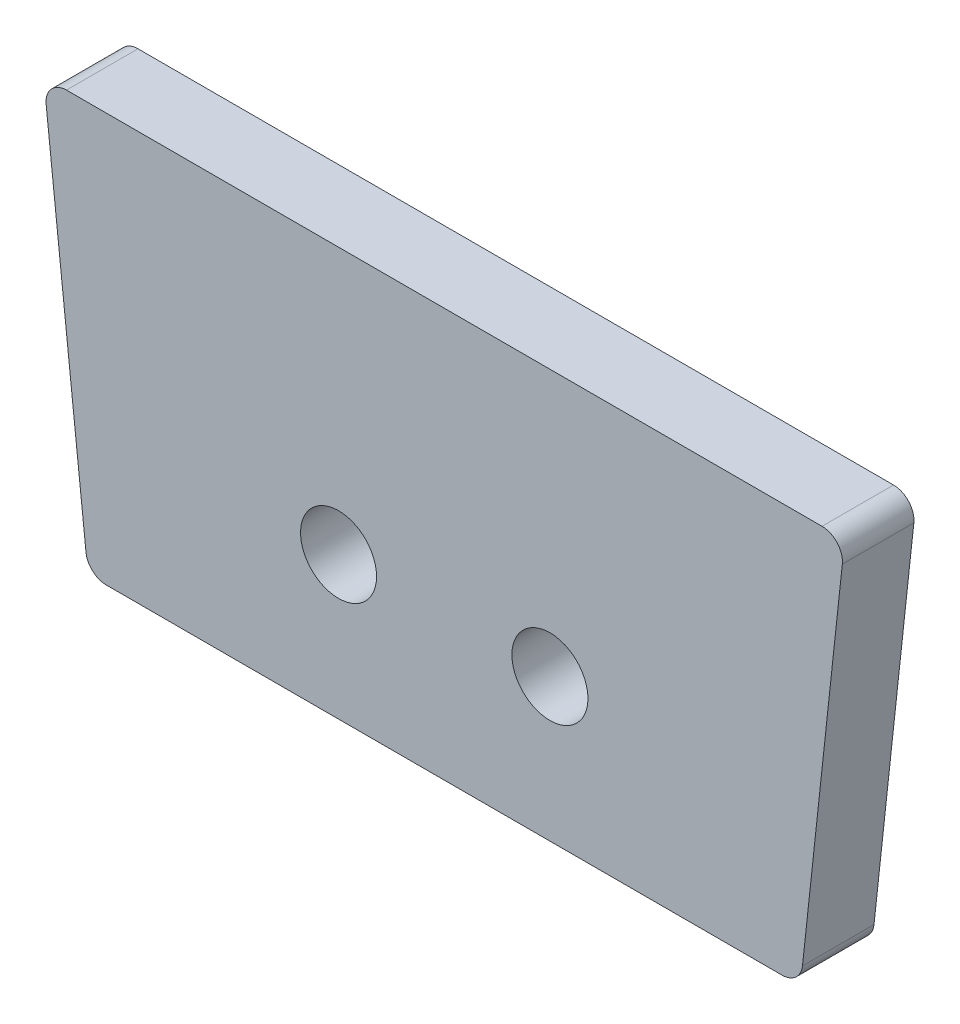
ISO-10303-21;
HEADER;
FILE_DESCRIPTION(('STEP AP214'),'2;1');
FILE_NAME('part.step','',(''),(''),'','','');
FILE_SCHEMA(('AUTOMOTIVE_DESIGN { 1 0 10303 214 1 1 1 1 }'));
ENDSEC;
DATA;
#1=APPLICATION_CONTEXT('core data for automotive mechanical design processes');
#2=APPLICATION_PROTOCOL_DEFINITION('international standard','automotive_design',2000,#1);
#3=PRODUCT_CONTEXT('',#1,'mechanical');
#4=PRODUCT('Part','Part','',(#3));
#5=PRODUCT_RELATED_PRODUCT_CATEGORY('part','',(#4));
#6=PRODUCT_DEFINITION_FORMATION('','',#4);
#7=PRODUCT_DEFINITION_CONTEXT('part definition',#1,'design');
#8=PRODUCT_DEFINITION('design','',#6,#7);
#9=PRODUCT_DEFINITION_SHAPE('','',#8);
#10=(LENGTH_UNIT() NAMED_UNIT(*) SI_UNIT(.MILLI.,.METRE.));
#11=(NAMED_UNIT(*) PLANE_ANGLE_UNIT() SI_UNIT($,.RADIAN.));
#12=(NAMED_UNIT(*) SI_UNIT($,.STERADIAN.) SOLID_ANGLE_UNIT());
#13=UNCERTAINTY_MEASURE_WITH_UNIT(LENGTH_MEASURE(1.E-05),#10,'distance_accuracy_value','');
#14=(GEOMETRIC_REPRESENTATION_CONTEXT(3) GLOBAL_UNCERTAINTY_ASSIGNED_CONTEXT((#13)) GLOBAL_UNIT_ASSIGNED_CONTEXT((#10,
#11,#12)) REPRESENTATION_CONTEXT('',''));
#15=CARTESIAN_POINT('',(0.,0.,0.));
#16=DIRECTION('',(0.,0.,1.));
#17=DIRECTION('',(1.,0.,0.));
#18=AXIS2_PLACEMENT_3D('',#15,#16,#17);
#19=CARTESIAN_POINT('',(0.,0.,3.5));
#20=DIRECTION('',(0.,0.,1.));
#21=DIRECTION('',(1.,0.,0.));
#22=AXIS2_PLACEMENT_3D('',#19,#20,#21);
#23=PLANE('',#22);
#24=CARTESIAN_POINT('',(-5.17192494727209,-7.3591908795816,3.5));
#25=DIRECTION('',(0.,0.,1.));
#26=DIRECTION('',(1.,0.,0.));
#27=AXIS2_PLACEMENT_3D('',#24,#25,#26);
#28=CIRCLE('',#27,1.8595685203675);
#29=CARTESIAN_POINT('',(-3.31235642690459,-7.3591908795816,3.5));
#30=VERTEX_POINT('',#29);
#31=EDGE_CURVE('E208',#30,#30,#28,.T.);
#32=ORIENTED_EDGE('',*,*,#31,.F.);
#33=EDGE_LOOP('',(#32));
#34=FACE_BOUND('',#33,.T.);
#35=DIRECTION('',(0.107703168683394,0.994183095539024,0.));
#36=VECTOR('',#35,1.);
#37=CARTESIAN_POINT('',(17.4334548784453,-14.3325728309597,3.5));
#38=LINE('',#37,#36);
#39=CARTESIAN_POINT('',(17.5301203685046,-13.4402759996431,3.5));
#40=VERTEX_POINT('',#39);
#41=CARTESIAN_POINT('',(19.4801203685046,4.5597240003569,3.5));
#42=VERTEX_POINT('',#41);
#43=EDGE_CURVE('E195',#40,#42,#38,.T.);
#44=ORIENTED_EDGE('',*,*,#43,.T.);
#45=CARTESIAN_POINT('',(18.4859372729655,4.6674271690403,3.5));
#46=DIRECTION('',(0.,0.,1.));
#47=DIRECTION('',(1.,0.,0.));
#48=AXIS2_PLACEMENT_3D('',#45,#46,#47);
#49=CIRCLE('',#48,1.);
#50=CARTESIAN_POINT('',(18.4859372729655,5.6674271690403,3.5));
#51=VERTEX_POINT('',#50);
#52=EDGE_CURVE('E168',#42,#51,#49,.T.);
#53=ORIENTED_EDGE('',*,*,#52,.T.);
#54=DIRECTION('',(-1.,0.,0.));
#55=VECTOR('',#54,1.);
#56=CARTESIAN_POINT('',(-19.6001215451119,5.66742716904029,3.5));
#57=LINE('',#56,#55);
#58=CARTESIAN_POINT('',(-18.4859372729655,5.66742716904029,3.5));
#59=VERTEX_POINT('',#58);
#60=EDGE_CURVE('E125',#51,#59,#57,.T.);
#61=ORIENTED_EDGE('',*,*,#60,.T.);
#62=CARTESIAN_POINT('',(-18.4859372729655,4.66742716904029,3.5));
#63=DIRECTION('',(0.,0.,1.));
#64=DIRECTION('',(1.,0.,0.));
#65=AXIS2_PLACEMENT_3D('',#62,#63,#64);
#66=CIRCLE('',#65,1.);
#67=CARTESIAN_POINT('',(-19.4801203685046,4.5597240003569,3.5));
#68=VERTEX_POINT('',#67);
#69=EDGE_CURVE('E60',#59,#68,#66,.T.);
#70=ORIENTED_EDGE('',*,*,#69,.T.);
#71=DIRECTION('',(0.107703168683394,-0.994183095539024,0.));
#72=VECTOR('',#71,1.);
#73=CARTESIAN_POINT('',(-17.4334548784453,-14.3325728309597,3.5));
#74=LINE('',#73,#72);
#75=CARTESIAN_POINT('',(-17.5301203685046,-13.4402759996431,3.5));
#76=VERTEX_POINT('',#75);
#77=EDGE_CURVE('E146',#68,#76,#74,.T.);
#78=ORIENTED_EDGE('',*,*,#77,.T.);
#79=CARTESIAN_POINT('',(-16.5359372729655,-13.3325728309597,3.5));
#80=DIRECTION('',(0.,0.,1.));
#81=DIRECTION('',(1.,0.,0.));
#82=AXIS2_PLACEMENT_3D('',#79,#80,#81);
#83=CIRCLE('',#82,1.);
#84=CARTESIAN_POINT('',(-16.5359372729655,-14.3325728309597,3.5));
#85=VERTEX_POINT('',#84);
#86=EDGE_CURVE('E162',#76,#85,#83,.T.);
#87=ORIENTED_EDGE('',*,*,#86,.T.);
#88=DIRECTION('',(1.,0.,0.));
#89=VECTOR('',#88,1.);
#90=CARTESIAN_POINT('',(-17.4334548784453,-14.3325728309597,3.5));
#91=LINE('',#90,#89);
#92=CARTESIAN_POINT('',(16.5359372729655,-14.3325728309597,3.5));
#93=VERTEX_POINT('',#92);
#94=EDGE_CURVE('E139',#85,#93,#91,.T.);
#95=ORIENTED_EDGE('',*,*,#94,.T.);
#96=CARTESIAN_POINT('',(16.5359372729655,-13.3325728309597,3.5));
#97=DIRECTION('',(0.,0.,1.));
#98=DIRECTION('',(1.,0.,0.));
#99=AXIS2_PLACEMENT_3D('',#96,#97,#98);
#100=CIRCLE('',#99,1.);
#101=EDGE_CURVE('E165',#93,#40,#100,.T.);
#102=ORIENTED_EDGE('',*,*,#101,.T.);
#103=EDGE_LOOP('',(#44,#53,#61,#70,#78,#87,#95,#102));
#104=FACE_BOUND('',#103,.T.);
#105=CARTESIAN_POINT('',(5.17192494727209,-7.3591908795816,3.5));
#106=DIRECTION('',(0.,0.,1.));
#107=DIRECTION('',(-1.,0.,0.));
#108=AXIS2_PLACEMENT_3D('',#105,#106,#107);
#109=CIRCLE('',#108,1.8595685203675);
#110=CARTESIAN_POINT('',(3.31235642690459,-7.3591908795816,3.5));
#111=VERTEX_POINT('',#110);
#112=EDGE_CURVE('E215',#111,#111,#109,.T.);
#113=ORIENTED_EDGE('',*,*,#112,.F.);
#114=EDGE_LOOP('',(#113));
#115=FACE_BOUND('',#114,.T.);
#116=ADVANCED_FACE('F39',(#34,#104,#115),#23,.T.);
#117=CARTESIAN_POINT('',(0.,0.,0.));
#118=DIRECTION('',(0.,0.,1.));
#119=DIRECTION('',(1.,0.,0.));
#120=AXIS2_PLACEMENT_3D('',#117,#118,#119);
#121=PLANE('',#120);
#122=DIRECTION('',(-1.,0.,0.));
#123=VECTOR('',#122,1.);
#124=CARTESIAN_POINT('',(-19.6001215451119,5.66742716904029,0.));
#125=LINE('',#124,#123);
#126=CARTESIAN_POINT('',(18.4859372729655,5.6674271690403,0.));
#127=VERTEX_POINT('',#126);
#128=CARTESIAN_POINT('',(-18.4859372729655,5.66742716904029,0.));
#129=VERTEX_POINT('',#128);
#130=EDGE_CURVE('E123',#127,#129,#125,.T.);
#131=ORIENTED_EDGE('',*,*,#130,.F.);
#132=CARTESIAN_POINT('',(18.4859372729655,4.6674271690403,0.));
#133=DIRECTION('',(0.,0.,1.));
#134=DIRECTION('',(1.,0.,0.));
#135=AXIS2_PLACEMENT_3D('',#132,#133,#134);
#136=CIRCLE('',#135,1.);
#137=CARTESIAN_POINT('',(19.4801203685046,4.5597240003569,0.));
#138=VERTEX_POINT('',#137);
#139=EDGE_CURVE('E105',#127,#138,#136,.F.);
#140=ORIENTED_EDGE('',*,*,#139,.T.);
#141=DIRECTION('',(0.107703168683394,0.994183095539024,0.));
#142=VECTOR('',#141,1.);
#143=CARTESIAN_POINT('',(17.4334548784453,-14.3325728309597,0.));
#144=LINE('',#143,#142);
#145=CARTESIAN_POINT('',(17.5301203685046,-13.4402759996431,0.));
#146=VERTEX_POINT('',#145);
#147=EDGE_CURVE('E135',#146,#138,#144,.T.);
#148=ORIENTED_EDGE('',*,*,#147,.F.);
#149=CARTESIAN_POINT('',(16.5359372729655,-13.3325728309597,0.));
#150=DIRECTION('',(0.,0.,1.));
#151=DIRECTION('',(1.,0.,0.));
#152=AXIS2_PLACEMENT_3D('',#149,#150,#151);
#153=CIRCLE('',#152,1.);
#154=CARTESIAN_POINT('',(16.5359372729655,-14.3325728309597,0.));
#155=VERTEX_POINT('',#154);
#156=EDGE_CURVE('E117',#146,#155,#153,.F.);
#157=ORIENTED_EDGE('',*,*,#156,.T.);
#158=DIRECTION('',(1.,0.,0.));
#159=VECTOR('',#158,1.);
#160=CARTESIAN_POINT('',(-17.4334548784453,-14.3325728309597,0.));
#161=LINE('',#160,#159);
#162=CARTESIAN_POINT('',(-16.5359372729655,-14.3325728309597,0.));
#163=VERTEX_POINT('',#162);
#164=EDGE_CURVE('E141',#163,#155,#161,.T.);
#165=ORIENTED_EDGE('',*,*,#164,.F.);
#166=CARTESIAN_POINT('',(-16.5359372729655,-13.3325728309597,0.));
#167=DIRECTION('',(0.,0.,1.));
#168=DIRECTION('',(1.,0.,0.));
#169=AXIS2_PLACEMENT_3D('',#166,#167,#168);
#170=CIRCLE('',#169,1.);
#171=CARTESIAN_POINT('',(-17.5301203685046,-13.4402759996431,0.));
#172=VERTEX_POINT('',#171);
#173=EDGE_CURVE('E150',#163,#172,#170,.F.);
#174=ORIENTED_EDGE('',*,*,#173,.T.);
#175=DIRECTION('',(0.107703168683394,-0.994183095539024,0.));
#176=VECTOR('',#175,1.);
#177=CARTESIAN_POINT('',(-17.4334548784453,-14.3325728309597,0.));
#178=LINE('',#177,#176);
#179=CARTESIAN_POINT('',(-19.4801203685046,4.5597240003569,0.));
#180=VERTEX_POINT('',#179);
#181=EDGE_CURVE('E134',#180,#172,#178,.T.);
#182=ORIENTED_EDGE('',*,*,#181,.F.);
#183=CARTESIAN_POINT('',(-18.4859372729655,4.66742716904029,0.));
#184=DIRECTION('',(0.,0.,1.));
#185=DIRECTION('',(1.,0.,0.));
#186=AXIS2_PLACEMENT_3D('',#183,#184,#185);
#187=CIRCLE('',#186,1.);
#188=EDGE_CURVE('E127',#180,#129,#187,.F.);
#189=ORIENTED_EDGE('',*,*,#188,.T.);
#190=EDGE_LOOP('',(#131,#140,#148,#157,#165,#174,#182,#189));
#191=FACE_BOUND('',#190,.T.);
#192=CARTESIAN_POINT('',(-5.17192494727209,-7.3591908795816,0.));
#193=DIRECTION('',(0.,0.,1.));
#194=DIRECTION('',(1.,0.,0.));
#195=AXIS2_PLACEMENT_3D('',#192,#193,#194);
#196=CIRCLE('',#195,1.8595685203675);
#197=CARTESIAN_POINT('',(-3.31235642690459,-7.3591908795816,0.));
#198=VERTEX_POINT('',#197);
#199=EDGE_CURVE('E201',#198,#198,#196,.T.);
#200=ORIENTED_EDGE('',*,*,#199,.T.);
#201=EDGE_LOOP('',(#200));
#202=FACE_BOUND('',#201,.T.);
#203=CARTESIAN_POINT('',(5.17192494727209,-7.3591908795816,0.));
#204=DIRECTION('',(0.,0.,1.));
#205=DIRECTION('',(-1.,0.,0.));
#206=AXIS2_PLACEMENT_3D('',#203,#204,#205);
#207=CIRCLE('',#206,1.8595685203675);
#208=CARTESIAN_POINT('',(3.31235642690459,-7.3591908795816,0.));
#209=VERTEX_POINT('',#208);
#210=EDGE_CURVE('E217',#209,#209,#207,.T.);
#211=ORIENTED_EDGE('',*,*,#210,.T.);
#212=EDGE_LOOP('',(#211));
#213=FACE_BOUND('',#212,.T.);
#214=ADVANCED_FACE('F130',(#191,#202,#213),#121,.F.);
#215=CARTESIAN_POINT('',(-17.4334548784453,-14.3325728309597,3.5));
#216=DIRECTION('',(0.,1.,0.));
#217=DIRECTION('',(0.,0.,1.));
#218=AXIS2_PLACEMENT_3D('',#215,#216,#217);
#219=PLANE('',#218);
#220=ORIENTED_EDGE('',*,*,#164,.T.);
#221=DIRECTION('',(0.,0.,-1.));
#222=VECTOR('',#221,1.);
#223=CARTESIAN_POINT('',(16.5359372729655,-14.3325728309597,3.5));
#224=LINE('',#223,#222);
#225=EDGE_CURVE('E175',#155,#93,#224,.F.);
#226=ORIENTED_EDGE('',*,*,#225,.T.);
#227=ORIENTED_EDGE('',*,*,#94,.F.);
#228=DIRECTION('',(0.,0.,-1.));
#229=VECTOR('',#228,1.);
#230=CARTESIAN_POINT('',(-16.5359372729655,-14.3325728309597,3.5));
#231=LINE('',#230,#229);
#232=EDGE_CURVE('E171',#85,#163,#231,.T.);
#233=ORIENTED_EDGE('',*,*,#232,.T.);
#234=EDGE_LOOP('',(#220,#226,#227,#233));
#235=FACE_BOUND('',#234,.T.);
#236=ADVANCED_FACE('F190',(#235),#219,.F.);
#237=CARTESIAN_POINT('',(17.4334548784453,-14.3325728309597,3.5));
#238=DIRECTION('',(-0.994183095539024,0.107703168683394,0.));
#239=DIRECTION('',(-0.107703168683394,-0.994183095539024,0.));
#240=AXIS2_PLACEMENT_3D('',#237,#238,#239);
#241=PLANE('',#240);
#242=ORIENTED_EDGE('',*,*,#147,.T.);
#243=DIRECTION('',(0.,0.,-1.));
#244=VECTOR('',#243,1.);
#245=CARTESIAN_POINT('',(19.4801203685046,4.5597240003569,3.5));
#246=LINE('',#245,#244);
#247=EDGE_CURVE('E110',#138,#42,#246,.F.);
#248=ORIENTED_EDGE('',*,*,#247,.T.);
#249=ORIENTED_EDGE('',*,*,#43,.F.);
#250=DIRECTION('',(0.,0.,-1.));
#251=VECTOR('',#250,1.);
#252=CARTESIAN_POINT('',(17.5301203685046,-13.4402759996431,3.5));
#253=LINE('',#252,#251);
#254=EDGE_CURVE('E116',#40,#146,#253,.T.);
#255=ORIENTED_EDGE('',*,*,#254,.T.);
#256=EDGE_LOOP('',(#242,#248,#249,#255));
#257=FACE_BOUND('',#256,.T.);
#258=ADVANCED_FACE('F243',(#257),#241,.F.);
#259=CARTESIAN_POINT('',(-19.6001215451119,5.66742716904029,3.5));
#260=DIRECTION('',(0.,-1.,0.));
#261=DIRECTION('',(1.,0.,0.));
#262=AXIS2_PLACEMENT_3D('',#259,#260,#261);
#263=PLANE('',#262);
#264=ORIENTED_EDGE('',*,*,#60,.F.);
#265=DIRECTION('',(0.,0.,-1.));
#266=VECTOR('',#265,1.);
#267=CARTESIAN_POINT('',(18.4859372729655,5.6674271690403,3.5));
#268=LINE('',#267,#266);
#269=EDGE_CURVE('E109',#51,#127,#268,.T.);
#270=ORIENTED_EDGE('',*,*,#269,.T.);
#271=ORIENTED_EDGE('',*,*,#130,.T.);
#272=DIRECTION('',(0.,0.,-1.));
#273=VECTOR('',#272,1.);
#274=CARTESIAN_POINT('',(-18.4859372729655,5.66742716904029,3.5));
#275=LINE('',#274,#273);
#276=EDGE_CURVE('E128',#129,#59,#275,.F.);
#277=ORIENTED_EDGE('',*,*,#276,.T.);
#278=EDGE_LOOP('',(#264,#270,#271,#277));
#279=FACE_BOUND('',#278,.T.);
#280=ADVANCED_FACE('F122',(#279),#263,.F.);
#281=CARTESIAN_POINT('',(-17.4334548784453,-14.3325728309597,3.5));
#282=DIRECTION('',(0.994183095539024,0.107703168683395,0.));
#283=DIRECTION('',(-0.107703168683395,0.994183095539024,0.));
#284=AXIS2_PLACEMENT_3D('',#281,#282,#283);
#285=PLANE('',#284);
#286=ORIENTED_EDGE('',*,*,#181,.T.);
#287=DIRECTION('',(0.,0.,-1.));
#288=VECTOR('',#287,1.);
#289=CARTESIAN_POINT('',(-17.5301203685046,-13.4402759996431,3.5));
#290=LINE('',#289,#288);
#291=EDGE_CURVE('E11',#172,#76,#290,.F.);
#292=ORIENTED_EDGE('',*,*,#291,.T.);
#293=ORIENTED_EDGE('',*,*,#77,.F.);
#294=DIRECTION('',(0.,0.,-1.));
#295=VECTOR('',#294,1.);
#296=CARTESIAN_POINT('',(-19.4801203685046,4.5597240003569,3.5));
#297=LINE('',#296,#295);
#298=EDGE_CURVE('E48',#68,#180,#297,.T.);
#299=ORIENTED_EDGE('',*,*,#298,.T.);
#300=EDGE_LOOP('',(#286,#292,#293,#299));
#301=FACE_BOUND('',#300,.T.);
#302=ADVANCED_FACE('F180',(#301),#285,.F.);
#303=CARTESIAN_POINT('',(-5.17192494727209,-7.3591908795816,3.5));
#304=DIRECTION('',(0.,0.,-1.));
#305=DIRECTION('',(-1.,0.,0.));
#306=AXIS2_PLACEMENT_3D('',#303,#304,#305);
#307=CYLINDRICAL_SURFACE('',#306,1.8595685203675);
#308=ORIENTED_EDGE('',*,*,#31,.T.);
#309=EDGE_LOOP('',(#308));
#310=FACE_BOUND('',#309,.T.);
#311=ORIENTED_EDGE('',*,*,#199,.F.);
#312=EDGE_LOOP('',(#311));
#313=FACE_BOUND('',#312,.T.);
#314=ADVANCED_FACE('F236',(#310,#313),#307,.F.);
#315=CARTESIAN_POINT('',(5.17192494727209,-7.3591908795816,3.5));
#316=DIRECTION('',(0.,0.,-1.));
#317=DIRECTION('',(-1.,0.,0.));
#318=AXIS2_PLACEMENT_3D('',#315,#316,#317);
#319=CYLINDRICAL_SURFACE('',#318,1.8595685203675);
#320=ORIENTED_EDGE('',*,*,#112,.T.);
#321=EDGE_LOOP('',(#320));
#322=FACE_BOUND('',#321,.T.);
#323=ORIENTED_EDGE('',*,*,#210,.F.);
#324=EDGE_LOOP('',(#323));
#325=FACE_BOUND('',#324,.T.);
#326=ADVANCED_FACE('F225',(#322,#325),#319,.F.);
#327=CARTESIAN_POINT('',(18.4859372729655,4.6674271690403,3.5));
#328=DIRECTION('',(0.,0.,-1.));
#329=DIRECTION('',(-1.,0.,0.));
#330=AXIS2_PLACEMENT_3D('',#327,#328,#329);
#331=CYLINDRICAL_SURFACE('',#330,1.);
#332=ORIENTED_EDGE('',*,*,#52,.F.);
#333=ORIENTED_EDGE('',*,*,#247,.F.);
#334=ORIENTED_EDGE('',*,*,#139,.F.);
#335=ORIENTED_EDGE('',*,*,#269,.F.);
#336=EDGE_LOOP('',(#332,#333,#334,#335));
#337=FACE_BOUND('',#336,.T.);
#338=ADVANCED_FACE('F108',(#337),#331,.T.);
#339=CARTESIAN_POINT('',(16.5359372729655,-13.3325728309597,3.5));
#340=DIRECTION('',(0.,0.,-1.));
#341=DIRECTION('',(-1.,0.,0.));
#342=AXIS2_PLACEMENT_3D('',#339,#340,#341);
#343=CYLINDRICAL_SURFACE('',#342,1.);
#344=ORIENTED_EDGE('',*,*,#101,.F.);
#345=ORIENTED_EDGE('',*,*,#225,.F.);
#346=ORIENTED_EDGE('',*,*,#156,.F.);
#347=ORIENTED_EDGE('',*,*,#254,.F.);
#348=EDGE_LOOP('',(#344,#345,#346,#347));
#349=FACE_BOUND('',#348,.T.);
#350=ADVANCED_FACE('F251',(#349),#343,.T.);
#351=CARTESIAN_POINT('',(-16.5359372729655,-13.3325728309597,3.5));
#352=DIRECTION('',(0.,0.,-1.));
#353=DIRECTION('',(-1.,0.,0.));
#354=AXIS2_PLACEMENT_3D('',#351,#352,#353);
#355=CYLINDRICAL_SURFACE('',#354,1.);
#356=ORIENTED_EDGE('',*,*,#86,.F.);
#357=ORIENTED_EDGE('',*,*,#291,.F.);
#358=ORIENTED_EDGE('',*,*,#173,.F.);
#359=ORIENTED_EDGE('',*,*,#232,.F.);
#360=EDGE_LOOP('',(#356,#357,#358,#359));
#361=FACE_BOUND('',#360,.T.);
#362=ADVANCED_FACE('F187',(#361),#355,.T.);
#363=CARTESIAN_POINT('',(-18.4859372729655,4.66742716904029,3.5));
#364=DIRECTION('',(0.,0.,-1.));
#365=DIRECTION('',(-1.,0.,0.));
#366=AXIS2_PLACEMENT_3D('',#363,#364,#365);
#367=CYLINDRICAL_SURFACE('',#366,1.);
#368=ORIENTED_EDGE('',*,*,#69,.F.);
#369=ORIENTED_EDGE('',*,*,#276,.F.);
#370=ORIENTED_EDGE('',*,*,#188,.F.);
#371=ORIENTED_EDGE('',*,*,#298,.F.);
#372=EDGE_LOOP('',(#368,#369,#370,#371));
#373=FACE_BOUND('',#372,.T.);
#374=ADVANCED_FACE('F41',(#373),#367,.T.);
#375=CLOSED_SHELL('',(#116,#214,#236,#258,#280,#302,#314,#326,#338,#350,#362,#374));
#376=MANIFOLD_SOLID_BREP('B2',#375);
#377=ADVANCED_BREP_SHAPE_REPRESENTATION('',(#18,#376),#14);
#378=SHAPE_DEFINITION_REPRESENTATION(#9,#377);
ENDSEC;
END-ISO-10303-21;
